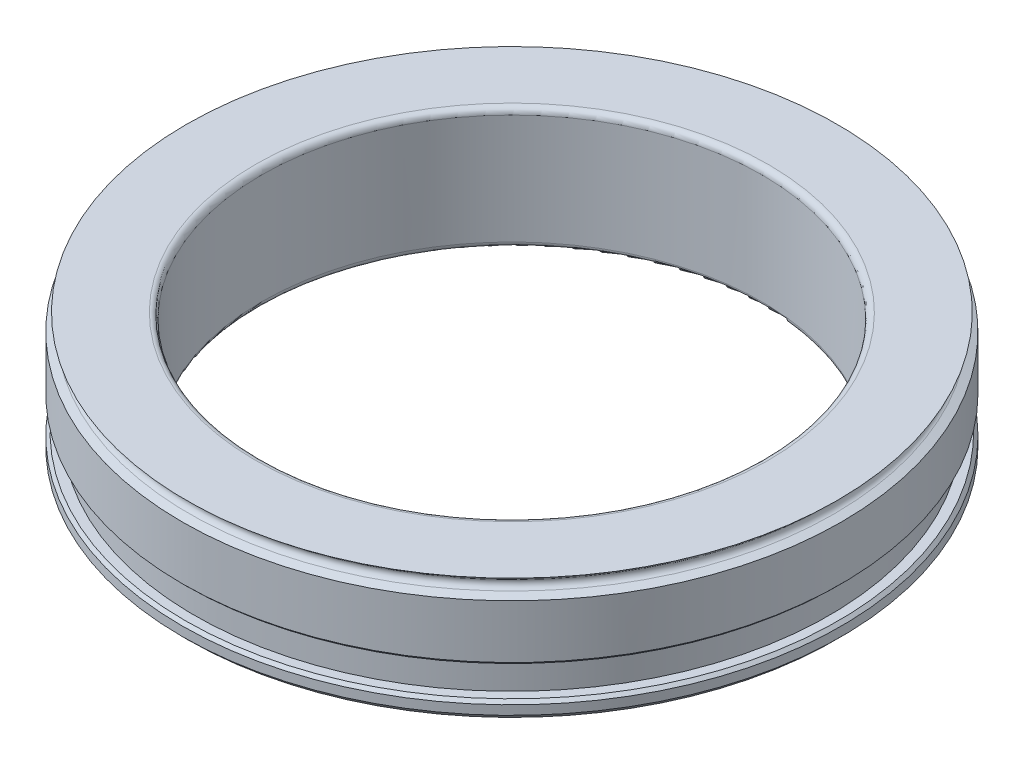
ISO-10303-21;
HEADER;
FILE_DESCRIPTION(('STEP AP214'),'2;1');
FILE_NAME('part.step','',(''),(''),'','','');
FILE_SCHEMA(('AUTOMOTIVE_DESIGN { 1 0 10303 214 1 1 1 1 }'));
ENDSEC;
DATA;
#1=APPLICATION_CONTEXT('core data for automotive mechanical design processes');
#2=APPLICATION_PROTOCOL_DEFINITION('international standard','automotive_design',2000,#1);
#3=PRODUCT_CONTEXT('',#1,'mechanical');
#4=PRODUCT('Part','Part','',(#3));
#5=PRODUCT_RELATED_PRODUCT_CATEGORY('part','',(#4));
#6=PRODUCT_DEFINITION_FORMATION('','',#4);
#7=PRODUCT_DEFINITION_CONTEXT('part definition',#1,'design');
#8=PRODUCT_DEFINITION('design','',#6,#7);
#9=PRODUCT_DEFINITION_SHAPE('','',#8);
#10=(LENGTH_UNIT() NAMED_UNIT(*) SI_UNIT(.MILLI.,.METRE.));
#11=(NAMED_UNIT(*) PLANE_ANGLE_UNIT() SI_UNIT($,.RADIAN.));
#12=(NAMED_UNIT(*) SI_UNIT($,.STERADIAN.) SOLID_ANGLE_UNIT());
#13=UNCERTAINTY_MEASURE_WITH_UNIT(LENGTH_MEASURE(1.E-05),#10,'distance_accuracy_value','');
#14=(GEOMETRIC_REPRESENTATION_CONTEXT(3) GLOBAL_UNCERTAINTY_ASSIGNED_CONTEXT((#13)) GLOBAL_UNIT_ASSIGNED_CONTEXT((#10,
#11,#12)) REPRESENTATION_CONTEXT('',''));
#15=CARTESIAN_POINT('',(0.,0.,0.));
#16=DIRECTION('',(0.,0.,1.));
#17=DIRECTION('',(1.,0.,0.));
#18=AXIS2_PLACEMENT_3D('',#15,#16,#17);
#19=CARTESIAN_POINT('',(0.,0.,0.));
#20=DIRECTION('',(0.,-1.,0.));
#21=DIRECTION('',(-1.,0.,0.));
#22=AXIS2_PLACEMENT_3D('',#19,#20,#21);
#23=CYLINDRICAL_SURFACE('',#22,42.5);
#24=CARTESIAN_POINT('',(0.,0.,0.));
#25=DIRECTION('',(0.,-1.,0.));
#26=DIRECTION('',(1.,0.,0.));
#27=AXIS2_PLACEMENT_3D('',#24,#25,#26);
#28=CIRCLE('',#27,42.5);
#29=CARTESIAN_POINT('',(42.5,0.,0.));
#30=VERTEX_POINT('',#29);
#31=EDGE_CURVE('E292',#30,#30,#28,.T.);
#32=ORIENTED_EDGE('',*,*,#31,.F.);
#33=DIRECTION('',(0.,1.,0.));
#34=VECTOR('',#33,1.);
#35=CARTESIAN_POINT('',(42.5,0.,0.));
#36=LINE('',#35,#34);
#37=CARTESIAN_POINT('',(42.5,2.2,0.));
#38=VERTEX_POINT('',#37);
#39=EDGE_CURVE('E11',#30,#38,#36,.T.);
#40=ORIENTED_EDGE('',*,*,#39,.T.);
#41=CARTESIAN_POINT('',(0.,2.2,0.));
#42=DIRECTION('',(0.,1.,0.));
#43=DIRECTION('',(-1.,0.,0.));
#44=AXIS2_PLACEMENT_3D('',#41,#42,#43);
#45=CIRCLE('',#44,42.5);
#46=EDGE_CURVE('E28',#38,#38,#45,.T.);
#47=ORIENTED_EDGE('',*,*,#46,.F.);
#48=ORIENTED_EDGE('',*,*,#39,.F.);
#49=EDGE_LOOP('',(#32,#40,#47,#48));
#50=FACE_BOUND('',#49,.T.);
#51=ADVANCED_FACE('F17',(#50),#23,.T.);
#52=CARTESIAN_POINT('',(0.,2.2,0.));
#53=DIRECTION('',(0.,-1.,0.));
#54=DIRECTION('',(0.,0.,-1.));
#55=AXIS2_PLACEMENT_3D('',#52,#53,#54);
#56=PLANE('',#55);
#57=ORIENTED_EDGE('',*,*,#46,.T.);
#58=EDGE_LOOP('',(#57));
#59=FACE_BOUND('',#58,.T.);
#60=CARTESIAN_POINT('',(0.,2.2,0.));
#61=DIRECTION('',(0.,-1.,0.));
#62=DIRECTION('',(-1.,0.,0.));
#63=AXIS2_PLACEMENT_3D('',#60,#61,#62);
#64=CIRCLE('',#63,45.5);
#65=CARTESIAN_POINT('',(45.5,2.2,0.));
#66=VERTEX_POINT('',#65);
#67=EDGE_CURVE('E358',#66,#66,#64,.T.);
#68=ORIENTED_EDGE('',*,*,#67,.T.);
#69=EDGE_LOOP('',(#68));
#70=FACE_BOUND('',#69,.T.);
#71=ADVANCED_FACE('F528',(#59,#70),#56,.T.);
#72=CARTESIAN_POINT('',(0.,0.,0.));
#73=DIRECTION('',(0.,-1.,0.));
#74=DIRECTION('',(-1.,0.,0.));
#75=AXIS2_PLACEMENT_3D('',#72,#73,#74);
#76=CYLINDRICAL_SURFACE('',#75,45.5);
#77=ORIENTED_EDGE('',*,*,#67,.F.);
#78=DIRECTION('',(0.,-1.,0.));
#79=VECTOR('',#78,1.);
#80=CARTESIAN_POINT('',(45.5,0.,0.));
#81=LINE('',#80,#79);
#82=CARTESIAN_POINT('',(45.5,0.,0.));
#83=VERTEX_POINT('',#82);
#84=EDGE_CURVE('E276',#66,#83,#81,.T.);
#85=ORIENTED_EDGE('',*,*,#84,.T.);
#86=CARTESIAN_POINT('',(0.,0.,0.));
#87=DIRECTION('',(0.,-1.,0.));
#88=DIRECTION('',(-1.,0.,0.));
#89=AXIS2_PLACEMENT_3D('',#86,#87,#88);
#90=CIRCLE('',#89,45.5);
#91=EDGE_CURVE('E426',#83,#83,#90,.T.);
#92=ORIENTED_EDGE('',*,*,#91,.T.);
#93=ORIENTED_EDGE('',*,*,#84,.F.);
#94=EDGE_LOOP('',(#77,#85,#92,#93));
#95=FACE_BOUND('',#94,.T.);
#96=ADVANCED_FACE('F533',(#95),#76,.F.);
#97=CARTESIAN_POINT('',(0.,8.,0.));
#98=DIRECTION('',(0.,1.,0.));
#99=DIRECTION('',(1.,0.,0.));
#100=AXIS2_PLACEMENT_3D('',#97,#98,#99);
#101=PLANE('',#100);
#102=CARTESIAN_POINT('',(0.,8.,0.));
#103=DIRECTION('',(0.,-1.,0.));
#104=DIRECTION('',(1.,0.,0.));
#105=AXIS2_PLACEMENT_3D('',#102,#103,#104);
#106=CIRCLE('',#105,52.);
#107=CARTESIAN_POINT('',(-52.,8.,0.));
#108=VERTEX_POINT('',#107);
#109=EDGE_CURVE('E291',#108,#108,#106,.T.);
#110=ORIENTED_EDGE('',*,*,#109,.F.);
#111=EDGE_LOOP('',(#110));
#112=FACE_BOUND('',#111,.T.);
#113=CARTESIAN_POINT('',(0.,8.,-5.753728067095E-13));
#114=DIRECTION('',(0.,1.,0.));
#115=DIRECTION('',(1.,0.,0.));
#116=AXIS2_PLACEMENT_3D('',#113,#114,#115);
#117=CIRCLE('',#116,53.5);
#118=CARTESIAN_POINT('',(0.,8.000000000001,53.4999999999984));
#119=VERTEX_POINT('',#118);
#120=EDGE_CURVE('E269',#119,#119,#117,.T.);
#121=ORIENTED_EDGE('',*,*,#120,.F.);
#122=EDGE_LOOP('',(#121));
#123=FACE_BOUND('',#122,.T.);
#124=ADVANCED_FACE('F562',(#112,#123),#101,.F.);
#125=CARTESIAN_POINT('',(0.,2.75,0.));
#126=DIRECTION('',(0.,1.,0.));
#127=DIRECTION('',(1.,0.,0.));
#128=AXIS2_PLACEMENT_3D('',#125,#126,#127);
#129=CYLINDRICAL_SURFACE('',#128,52.);
#130=ORIENTED_EDGE('',*,*,#109,.T.);
#131=DIRECTION('',(0.,-1.,0.));
#132=VECTOR('',#131,1.);
#133=CARTESIAN_POINT('',(-52.,2.75,0.));
#134=LINE('',#133,#132);
#135=CARTESIAN_POINT('',(-52.,3.,0.));
#136=VERTEX_POINT('',#135);
#137=EDGE_CURVE('E79',#108,#136,#134,.T.);
#138=ORIENTED_EDGE('',*,*,#137,.T.);
#139=CARTESIAN_POINT('',(0.,3.,0.));
#140=DIRECTION('',(0.,1.,0.));
#141=DIRECTION('',(1.,0.,0.));
#142=AXIS2_PLACEMENT_3D('',#139,#140,#141);
#143=CIRCLE('',#142,52.);
#144=EDGE_CURVE('E288',#136,#136,#143,.T.);
#145=ORIENTED_EDGE('',*,*,#144,.T.);
#146=ORIENTED_EDGE('',*,*,#137,.F.);
#147=EDGE_LOOP('',(#130,#138,#145,#146));
#148=FACE_BOUND('',#147,.T.);
#149=ADVANCED_FACE('F522',(#148),#129,.T.);
#150=CARTESIAN_POINT('',(0.,3.,0.));
#151=DIRECTION('',(0.,1.,0.));
#152=DIRECTION('',(1.,0.,0.));
#153=AXIS2_PLACEMENT_3D('',#150,#151,#152);
#154=PLANE('',#153);
#155=ORIENTED_EDGE('',*,*,#144,.F.);
#156=EDGE_LOOP('',(#155));
#157=FACE_BOUND('',#156,.T.);
#158=CARTESIAN_POINT('',(0.,3.,0.));
#159=DIRECTION('',(0.,-1.,0.));
#160=DIRECTION('',(1.,0.,0.));
#161=AXIS2_PLACEMENT_3D('',#158,#159,#160);
#162=CIRCLE('',#161,53.5);
#163=CARTESIAN_POINT('',(0.,2.999999999999,53.499999999999));
#164=VERTEX_POINT('',#163);
#165=EDGE_CURVE('E91',#164,#164,#162,.T.);
#166=ORIENTED_EDGE('',*,*,#165,.F.);
#167=EDGE_LOOP('',(#166));
#168=FACE_BOUND('',#167,.T.);
#169=ADVANCED_FACE('F514',(#157,#168),#154,.T.);
#170=CARTESIAN_POINT('',(0.,2.750000000108,0.));
#171=DIRECTION('',(0.,-1.,0.));
#172=DIRECTION('',(0.,0.,-1.));
#173=AXIS2_PLACEMENT_3D('',#170,#171,#172);
#174=CONICAL_SURFACE('',#173,53.74999999989,0.785398163397448);
#175=CARTESIAN_POINT('',(0.,2.5,0.));
#176=DIRECTION('',(0.,-1.,0.));
#177=DIRECTION('',(-1.,0.,0.));
#178=AXIS2_PLACEMENT_3D('',#175,#176,#177);
#179=CIRCLE('',#178,54.);
#180=CARTESIAN_POINT('',(-54.,2.5,0.));
#181=VERTEX_POINT('',#180);
#182=CARTESIAN_POINT('',(0.,2.499999999999,53.999999999999));
#183=VERTEX_POINT('',#182);
#184=EDGE_CURVE('E364',#181,#183,#179,.T.);
#185=ORIENTED_EDGE('',*,*,#184,.F.);
#186=CARTESIAN_POINT('',(0.,2.5,0.));
#187=DIRECTION('',(0.,-1.,0.));
#188=DIRECTION('',(-1.,0.,0.));
#189=AXIS2_PLACEMENT_3D('',#186,#187,#188);
#190=CIRCLE('',#189,54.);
#191=EDGE_CURVE('E304',#183,#181,#190,.T.);
#192=ORIENTED_EDGE('',*,*,#191,.F.);
#193=DIRECTION('',(0.,0.707106781186548,-0.707106781186548));
#194=VECTOR('',#193,1.);
#195=CARTESIAN_POINT('',(0.,2.750000000108,53.74999999989));
#196=LINE('',#195,#194);
#197=EDGE_CURVE('E415',#183,#164,#196,.T.);
#198=ORIENTED_EDGE('',*,*,#197,.T.);
#199=ORIENTED_EDGE('',*,*,#165,.T.);
#200=ORIENTED_EDGE('',*,*,#197,.F.);
#201=EDGE_LOOP('',(#185,#192,#198,#199,#200));
#202=FACE_BOUND('',#201,.T.);
#203=ADVANCED_FACE('F512',(#202),#174,.T.);
#204=CARTESIAN_POINT('',(0.,0.4999999999025,0.));
#205=DIRECTION('',(0.,1.,0.));
#206=DIRECTION('',(0.,0.,-1.));
#207=AXIS2_PLACEMENT_3D('',#204,#205,#206);
#208=CONICAL_SURFACE('',#207,53.4999999999,0.785398163397448);
#209=CARTESIAN_POINT('',(0.,0.9999999999998,0.));
#210=DIRECTION('',(0.,1.,0.));
#211=DIRECTION('',(1.,0.,0.));
#212=AXIS2_PLACEMENT_3D('',#209,#210,#211);
#213=CIRCLE('',#212,54.);
#214=CARTESIAN_POINT('',(0.,1.00000000000115,53.9999999999987));
#215=VERTEX_POINT('',#214);
#216=CARTESIAN_POINT('',(-54.,0.9999999999998,0.));
#217=VERTEX_POINT('',#216);
#218=EDGE_CURVE('E281',#215,#217,#213,.T.);
#219=ORIENTED_EDGE('',*,*,#218,.F.);
#220=DIRECTION('',(0.,-0.707106781186548,-0.707106781186548));
#221=VECTOR('',#220,1.);
#222=CARTESIAN_POINT('',(0.,0.4999999999025,53.4999999999));
#223=LINE('',#222,#221);
#224=CARTESIAN_POINT('',(0.,1.11868847518792E-12,52.9999999999986));
#225=VERTEX_POINT('',#224);
#226=EDGE_CURVE('E272',#215,#225,#223,.T.);
#227=ORIENTED_EDGE('',*,*,#226,.T.);
#228=CARTESIAN_POINT('',(0.,0.,-2.849977453795E-13));
#229=DIRECTION('',(0.,1.,0.));
#230=DIRECTION('',(1.,0.,0.));
#231=AXIS2_PLACEMENT_3D('',#228,#229,#230);
#232=CIRCLE('',#231,53.);
#233=EDGE_CURVE('E316',#225,#225,#232,.T.);
#234=ORIENTED_EDGE('',*,*,#233,.T.);
#235=ORIENTED_EDGE('',*,*,#226,.F.);
#236=CARTESIAN_POINT('',(0.,0.9999999999998,0.));
#237=DIRECTION('',(0.,1.,0.));
#238=DIRECTION('',(1.,0.,0.));
#239=AXIS2_PLACEMENT_3D('',#236,#237,#238);
#240=CIRCLE('',#239,54.);
#241=EDGE_CURVE('E277',#217,#215,#240,.T.);
#242=ORIENTED_EDGE('',*,*,#241,.F.);
#243=EDGE_LOOP('',(#219,#227,#234,#235,#242));
#244=FACE_BOUND('',#243,.T.);
#245=ADVANCED_FACE('F506',(#244),#208,.T.);
#246=CARTESIAN_POINT('',(0.,8.249999999892,-5.753728067095E-13));
#247=DIRECTION('',(0.,1.,0.));
#248=DIRECTION('',(0.,0.,-1.));
#249=AXIS2_PLACEMENT_3D('',#246,#247,#248);
#250=CONICAL_SURFACE('',#249,53.74999999989,0.785398163397448);
#251=CARTESIAN_POINT('',(0.,8.5,0.));
#252=DIRECTION('',(0.,1.,0.));
#253=DIRECTION('',(1.,0.,0.));
#254=AXIS2_PLACEMENT_3D('',#251,#252,#253);
#255=CIRCLE('',#254,54.);
#256=CARTESIAN_POINT('',(0.,8.50000000000129,53.9999999999987));
#257=VERTEX_POINT('',#256);
#258=CARTESIAN_POINT('',(-54.,8.5,0.));
#259=VERTEX_POINT('',#258);
#260=EDGE_CURVE('E353',#257,#259,#255,.T.);
#261=ORIENTED_EDGE('',*,*,#260,.F.);
#262=DIRECTION('',(0.,-0.707106781186548,-0.707106781186548));
#263=VECTOR('',#262,1.);
#264=CARTESIAN_POINT('',(0.,8.249999999892,53.7499999998894));
#265=LINE('',#264,#263);
#266=EDGE_CURVE('E273',#257,#119,#265,.T.);
#267=ORIENTED_EDGE('',*,*,#266,.T.);
#268=ORIENTED_EDGE('',*,*,#120,.T.);
#269=ORIENTED_EDGE('',*,*,#266,.F.);
#270=CARTESIAN_POINT('',(0.,8.5,0.));
#271=DIRECTION('',(0.,1.,0.));
#272=DIRECTION('',(1.,0.,0.));
#273=AXIS2_PLACEMENT_3D('',#270,#271,#272);
#274=CIRCLE('',#273,54.);
#275=EDGE_CURVE('E349',#259,#257,#274,.T.);
#276=ORIENTED_EDGE('',*,*,#275,.F.);
#277=EDGE_LOOP('',(#261,#267,#268,#269,#276));
#278=FACE_BOUND('',#277,.T.);
#279=ADVANCED_FACE('F19',(#278),#250,.T.);
#280=CARTESIAN_POINT('',(0.,-1.,0.));
#281=DIRECTION('',(0.,1.,0.));
#282=DIRECTION('',(1.,0.,0.));
#283=AXIS2_PLACEMENT_3D('',#280,#281,#282);
#284=CYLINDRICAL_SURFACE('',#283,54.);
#285=ORIENTED_EDGE('',*,*,#184,.T.);
#286=ORIENTED_EDGE('',*,*,#191,.T.);
#287=DIRECTION('',(0.,-1.,0.));
#288=VECTOR('',#287,1.);
#289=CARTESIAN_POINT('',(-54.,-1.,0.));
#290=LINE('',#289,#288);
#291=EDGE_CURVE('E282',#181,#217,#290,.T.);
#292=ORIENTED_EDGE('',*,*,#291,.T.);
#293=ORIENTED_EDGE('',*,*,#241,.T.);
#294=ORIENTED_EDGE('',*,*,#218,.T.);
#295=ORIENTED_EDGE('',*,*,#291,.F.);
#296=EDGE_LOOP('',(#285,#286,#292,#293,#294,#295));
#297=FACE_BOUND('',#296,.T.);
#298=ADVANCED_FACE('F509',(#297),#284,.T.);
#299=CARTESIAN_POINT('',(0.,-1.,0.));
#300=DIRECTION('',(0.,1.,0.));
#301=DIRECTION('',(1.,0.,0.));
#302=AXIS2_PLACEMENT_3D('',#299,#300,#301);
#303=CYLINDRICAL_SURFACE('',#302,54.);
#304=CARTESIAN_POINT('',(0.,17.25938016844,0.));
#305=DIRECTION('',(0.,-1.,0.));
#306=DIRECTION('',(1.,0.,0.));
#307=AXIS2_PLACEMENT_3D('',#304,#305,#306);
#308=CIRCLE('',#307,54.);
#309=CARTESIAN_POINT('',(54.,17.25938016844,0.));
#310=VERTEX_POINT('',#309);
#311=CARTESIAN_POINT('',(-54.,17.25938016844,0.));
#312=VERTEX_POINT('',#311);
#313=EDGE_CURVE('E341',#310,#312,#308,.T.);
#314=ORIENTED_EDGE('',*,*,#313,.T.);
#315=DIRECTION('',(0.,-1.,0.));
#316=VECTOR('',#315,1.);
#317=CARTESIAN_POINT('',(-54.,-1.,0.));
#318=LINE('',#317,#316);
#319=EDGE_CURVE('E354',#312,#259,#318,.T.);
#320=ORIENTED_EDGE('',*,*,#319,.T.);
#321=ORIENTED_EDGE('',*,*,#275,.T.);
#322=ORIENTED_EDGE('',*,*,#260,.T.);
#323=ORIENTED_EDGE('',*,*,#319,.F.);
#324=CARTESIAN_POINT('',(0.,17.25938016844,0.));
#325=DIRECTION('',(0.,-1.,0.));
#326=DIRECTION('',(1.,0.,0.));
#327=AXIS2_PLACEMENT_3D('',#324,#325,#326);
#328=CIRCLE('',#327,54.);
#329=EDGE_CURVE('E370',#312,#310,#328,.T.);
#330=ORIENTED_EDGE('',*,*,#329,.T.);
#331=EDGE_LOOP('',(#314,#320,#321,#322,#323,#330));
#332=FACE_BOUND('',#331,.T.);
#333=ADVANCED_FACE('F544',(#332),#303,.T.);
#334=CARTESIAN_POINT('',(0.,17.51588508953,0.));
#335=DIRECTION('',(0.,-1.,0.));
#336=DIRECTION('',(-1.,0.,0.));
#337=AXIS2_PLACEMENT_3D('',#334,#335,#336);
#338=CONICAL_SURFACE('',#337,53.38438818938,1.17600520709514);
#339=ORIENTED_EDGE('',*,*,#313,.F.);
#340=DIRECTION('',(-0.923076923076926,0.384615384615378,0.));
#341=VECTOR('',#340,1.);
#342=CARTESIAN_POINT('',(53.38438818938,17.51588508953,0.));
#343=LINE('',#342,#341);
#344=CARTESIAN_POINT('',(52.7687763787521,17.772390010625,0.));
#345=VERTEX_POINT('',#344);
#346=EDGE_CURVE('E347',#310,#345,#343,.T.);
#347=ORIENTED_EDGE('',*,*,#346,.T.);
#348=CARTESIAN_POINT('',(0.,17.77239001062,0.));
#349=DIRECTION('',(0.,-1.,0.));
#350=DIRECTION('',(-1.,0.,0.));
#351=AXIS2_PLACEMENT_3D('',#348,#349,#350);
#352=CIRCLE('',#351,52.76877637875);
#353=CARTESIAN_POINT('',(52.7682735901043,17.77239001062,-0.230353707210886));
#354=VERTEX_POINT('',#353);
#355=EDGE_CURVE('E300',#345,#354,#352,.T.);
#356=ORIENTED_EDGE('',*,*,#355,.T.);
#357=CARTESIAN_POINT('',(0.,17.77239001062,0.));
#358=DIRECTION('',(0.,-1.,0.));
#359=DIRECTION('',(-1.,0.,0.));
#360=AXIS2_PLACEMENT_3D('',#357,#358,#359);
#361=CIRCLE('',#360,52.76877637875);
#362=EDGE_CURVE('E337',#354,#345,#361,.T.);
#363=ORIENTED_EDGE('',*,*,#362,.T.);
#364=ORIENTED_EDGE('',*,*,#346,.F.);
#365=ORIENTED_EDGE('',*,*,#329,.F.);
#366=EDGE_LOOP('',(#339,#347,#356,#363,#364,#365));
#367=FACE_BOUND('',#366,.T.);
#368=ADVANCED_FACE('F540',(#367),#338,.T.);
#369=CARTESIAN_POINT('',(0.,18.6954669337,0.));
#370=DIRECTION('',(0.,1.,0.));
#371=DIRECTION('',(-0.99999047185324,0.,0.00436534107892717));
#372=AXIS2_PLACEMENT_3D('',#369,#370,#371);
#373=TOROIDAL_SURFACE('',#372,53.15339176337,1.);
#374=CARTESIAN_POINT('',(0.,19.53887872652,0.));
#375=DIRECTION('',(0.,-1.,0.));
#376=DIRECTION('',(-1.,0.,0.));
#377=AXIS2_PLACEMENT_3D('',#374,#375,#376);
#378=CIRCLE('',#377,52.61612409476);
#379=CARTESIAN_POINT('',(52.6156227606077,19.53887872652,-0.229687327924792));
#380=VERTEX_POINT('',#379);
#381=CARTESIAN_POINT('',(-52.6161240947599,19.5388787265202,0.));
#382=VERTEX_POINT('',#381);
#383=EDGE_CURVE('E404',#380,#382,#378,.T.);
#384=ORIENTED_EDGE('',*,*,#383,.T.);
#385=CARTESIAN_POINT('',(0.,19.53887872652,0.));
#386=DIRECTION('',(0.,-1.,0.));
#387=DIRECTION('',(-1.,0.,0.));
#388=AXIS2_PLACEMENT_3D('',#385,#386,#387);
#389=CIRCLE('',#388,52.61612409476);
#390=EDGE_CURVE('E301',#382,#380,#389,.T.);
#391=ORIENTED_EDGE('',*,*,#390,.T.);
#392=CARTESIAN_POINT('',(53.1528853100525,18.6954669337,-0.232032684548955));
#393=DIRECTION('',(0.0043653410789273,0.,0.99999047185324));
#394=DIRECTION('',(0.99999047185324,0.,-0.0043653410789273));
#395=AXIS2_PLACEMENT_3D('',#392,#393,#394);
#396=CIRCLE('',#395,1.);
#397=EDGE_CURVE('E296',#380,#354,#396,.T.);
#398=ORIENTED_EDGE('',*,*,#397,.T.);
#399=ORIENTED_EDGE('',*,*,#355,.F.);
#400=ORIENTED_EDGE('',*,*,#362,.F.);
#401=ORIENTED_EDGE('',*,*,#397,.F.);
#402=EDGE_LOOP('',(#384,#391,#398,#399,#400,#401));
#403=FACE_BOUND('',#402,.T.);
#404=ADVANCED_FACE('F543',(#403),#373,.F.);
#405=CARTESIAN_POINT('',(0.,19.76943936326,0.));
#406=DIRECTION('',(0.,1.,0.));
#407=DIRECTION('',(1.,0.,0.));
#408=AXIS2_PLACEMENT_3D('',#405,#406,#407);
#409=CONICAL_SURFACE('',#408,52.97806204738,1.00360219003479);
#410=CARTESIAN_POINT('',(0.,20.,0.));
#411=DIRECTION('',(0.,1.,0.));
#412=DIRECTION('',(1.,0.,0.));
#413=AXIS2_PLACEMENT_3D('',#410,#411,#412);
#414=CIRCLE('',#413,53.34);
#415=CARTESIAN_POINT('',(-53.34,20.,0.));
#416=VERTEX_POINT('',#415);
#417=EDGE_CURVE('E21',#416,#416,#414,.T.);
#418=ORIENTED_EDGE('',*,*,#417,.F.);
#419=DIRECTION('',(0.843411792818451,-0.537267668611063,0.));
#420=VECTOR('',#419,1.);
#421=CARTESIAN_POINT('',(-52.97806204738,19.76943936326,0.));
#422=LINE('',#421,#420);
#423=EDGE_CURVE('E400',#416,#382,#422,.T.);
#424=ORIENTED_EDGE('',*,*,#423,.T.);
#425=ORIENTED_EDGE('',*,*,#383,.F.);
#426=ORIENTED_EDGE('',*,*,#390,.F.);
#427=ORIENTED_EDGE('',*,*,#423,.F.);
#428=EDGE_LOOP('',(#418,#424,#425,#426,#427));
#429=FACE_BOUND('',#428,.T.);
#430=ADVANCED_FACE('F393',(#429),#409,.T.);
#431=CARTESIAN_POINT('',(0.,20.,0.));
#432=DIRECTION('',(0.,1.,0.));
#433=DIRECTION('',(1.,0.,0.));
#434=AXIS2_PLACEMENT_3D('',#431,#432,#433);
#435=PLANE('',#434);
#436=CARTESIAN_POINT('',(0.,20.,0.));
#437=DIRECTION('',(0.,1.,0.));
#438=DIRECTION('',(-1.,0.,0.));
#439=AXIS2_PLACEMENT_3D('',#436,#437,#438);
#440=CIRCLE('',#439,42.);
#441=CARTESIAN_POINT('',(41.9992294255706,20.,0.254416309001935));
#442=VERTEX_POINT('',#441);
#443=EDGE_CURVE('E262',#442,#442,#440,.T.);
#444=ORIENTED_EDGE('',*,*,#443,.F.);
#445=EDGE_LOOP('',(#444));
#446=FACE_BOUND('',#445,.T.);
#447=ORIENTED_EDGE('',*,*,#417,.T.);
#448=EDGE_LOOP('',(#447));
#449=FACE_BOUND('',#448,.T.);
#450=ADVANCED_FACE('F390',(#446,#449),#435,.T.);
#451=CARTESIAN_POINT('',(0.,19.,0.));
#452=DIRECTION('',(0.,1.,0.));
#453=DIRECTION('',(-0.999981652989776,0.,-0.00605753116671286));
#454=AXIS2_PLACEMENT_3D('',#451,#452,#453);
#455=TOROIDAL_SURFACE('',#454,42.,1.);
#456=CARTESIAN_POINT('',(0.,19.,0.));
#457=DIRECTION('',(0.,1.,0.));
#458=DIRECTION('',(-1.,0.,0.));
#459=AXIS2_PLACEMENT_3D('',#456,#457,#458);
#460=CIRCLE('',#459,41.);
#461=CARTESIAN_POINT('',(-41.,19.,0.));
#462=VERTEX_POINT('',#461);
#463=CARTESIAN_POINT('',(40.9992477725808,19.,0.248358777835222));
#464=VERTEX_POINT('',#463);
#465=EDGE_CURVE('E336',#462,#464,#460,.T.);
#466=ORIENTED_EDGE('',*,*,#465,.F.);
#467=CARTESIAN_POINT('',(0.,19.,0.));
#468=DIRECTION('',(0.,1.,0.));
#469=DIRECTION('',(-1.,0.,0.));
#470=AXIS2_PLACEMENT_3D('',#467,#468,#469);
#471=CIRCLE('',#470,41.);
#472=EDGE_CURVE('E263',#464,#462,#471,.T.);
#473=ORIENTED_EDGE('',*,*,#472,.F.);
#474=CARTESIAN_POINT('',(41.9992294255706,19.,0.254416309001935));
#475=DIRECTION('',(0.00605753116671273,0.,-0.999981652989776));
#476=DIRECTION('',(0.999981652989776,0.,0.00605753116671273));
#477=AXIS2_PLACEMENT_3D('',#474,#475,#476);
#478=CIRCLE('',#477,1.);
#479=EDGE_CURVE('E258',#464,#442,#478,.T.);
#480=ORIENTED_EDGE('',*,*,#479,.T.);
#481=ORIENTED_EDGE('',*,*,#443,.T.);
#482=ORIENTED_EDGE('',*,*,#479,.F.);
#483=EDGE_LOOP('',(#466,#473,#480,#481,#482));
#484=FACE_BOUND('',#483,.T.);
#485=ADVANCED_FACE('F387',(#484),#455,.T.);
#486=CARTESIAN_POINT('',(0.,-1.,0.));
#487=DIRECTION('',(0.,1.,0.));
#488=DIRECTION('',(1.,0.,0.));
#489=AXIS2_PLACEMENT_3D('',#486,#487,#488);
#490=CYLINDRICAL_SURFACE('',#489,41.);
#491=CARTESIAN_POINT('',(0.,1.,0.));
#492=DIRECTION('',(0.,1.,0.));
#493=DIRECTION('',(1.,0.,0.));
#494=AXIS2_PLACEMENT_3D('',#491,#492,#493);
#495=CIRCLE('',#494,41.);
#496=CARTESIAN_POINT('',(-41.,1.,0.));
#497=VERTEX_POINT('',#496);
#498=CARTESIAN_POINT('',(-40.9993153992791,1.,-0.236932037593123));
#499=VERTEX_POINT('',#498);
#500=EDGE_CURVE('E321',#497,#499,#495,.T.);
#501=ORIENTED_EDGE('',*,*,#500,.F.);
#502=DIRECTION('',(0.,1.,0.));
#503=VECTOR('',#502,1.);
#504=CARTESIAN_POINT('',(-41.,-1.,0.));
#505=LINE('',#504,#503);
#506=EDGE_CURVE('E324',#497,#462,#505,.T.);
#507=ORIENTED_EDGE('',*,*,#506,.T.);
#508=ORIENTED_EDGE('',*,*,#465,.T.);
#509=ORIENTED_EDGE('',*,*,#472,.T.);
#510=ORIENTED_EDGE('',*,*,#506,.F.);
#511=CARTESIAN_POINT('',(0.,1.,0.));
#512=DIRECTION('',(0.,1.,0.));
#513=DIRECTION('',(1.,0.,0.));
#514=AXIS2_PLACEMENT_3D('',#511,#512,#513);
#515=CIRCLE('',#514,41.);
#516=EDGE_CURVE('E325',#499,#497,#515,.T.);
#517=ORIENTED_EDGE('',*,*,#516,.F.);
#518=EDGE_LOOP('',(#501,#507,#508,#509,#510,#517));
#519=FACE_BOUND('',#518,.T.);
#520=ADVANCED_FACE('F381',(#519),#490,.F.);
#521=CARTESIAN_POINT('',(0.,1.,0.));
#522=DIRECTION('',(0.,1.,0.));
#523=DIRECTION('',(0.999983302421441,0.,0.00577883018519824));
#524=AXIS2_PLACEMENT_3D('',#521,#522,#523);
#525=TOROIDAL_SURFACE('',#524,42.,1.);
#526=CARTESIAN_POINT('',(0.,0.,0.));
#527=DIRECTION('',(0.,1.,0.));
#528=DIRECTION('',(1.,0.,0.));
#529=AXIS2_PLACEMENT_3D('',#526,#527,#528);
#530=CIRCLE('',#529,42.);
#531=CARTESIAN_POINT('',(-41.9992987017005,0.,-0.242710867778321));
#532=VERTEX_POINT('',#531);
#533=EDGE_CURVE('E295',#532,#532,#530,.T.);
#534=ORIENTED_EDGE('',*,*,#533,.F.);
#535=CARTESIAN_POINT('',(-41.9992987017005,1.,-0.242710867778321));
#536=DIRECTION('',(-0.00577883018519811,0.,0.999983302421441));
#537=DIRECTION('',(-0.999983302421441,0.,-0.00577883018519811));
#538=AXIS2_PLACEMENT_3D('',#535,#536,#537);
#539=CIRCLE('',#538,1.);
#540=EDGE_CURVE('E194',#532,#499,#539,.T.);
#541=ORIENTED_EDGE('',*,*,#540,.T.);
#542=ORIENTED_EDGE('',*,*,#516,.T.);
#543=ORIENTED_EDGE('',*,*,#500,.T.);
#544=ORIENTED_EDGE('',*,*,#540,.F.);
#545=EDGE_LOOP('',(#534,#541,#542,#543,#544));
#546=FACE_BOUND('',#545,.T.);
#547=ADVANCED_FACE('F575',(#546),#525,.T.);
#548=CARTESIAN_POINT('',(42.43524478544,10.44809233428,-24.5));
#549=DIRECTION('',(0.,-1.,0.));
#550=DIRECTION('',(-0.500000000000017,0.,-0.866025403784429));
#551=AXIS2_PLACEMENT_3D('',#548,#549,#550);
#552=CONICAL_SURFACE('',#551,0.904249121851,1.02974425867665);
#553=DIRECTION('',(0.42858365035107,-0.515038074910054,0.742328657701356));
#554=VECTOR('',#553,1.);
#555=CARTESIAN_POINT('',(42.8873693463655,10.44809233428,-23.7168972891273));
#556=LINE('',#555,#554);
#557=CARTESIAN_POINT('',(42.43524478544,10.9914200214,-24.5));
#558=VERTEX_POINT('',#557);
#559=CARTESIAN_POINT('',(43.26024478544,10.,-23.0710580837557));
#560=VERTEX_POINT('',#559);
#561=EDGE_CURVE('E234',#558,#560,#556,.T.);
#562=ORIENTED_EDGE('',*,*,#561,.T.);
#563=CARTESIAN_POINT('',(42.43524478544,10.,-24.5));
#564=DIRECTION('',(0.,-1.,0.));
#565=DIRECTION('',(-0.500000000000017,0.,-0.866025403784429));
#566=AXIS2_PLACEMENT_3D('',#563,#564,#565);
#567=CIRCLE('',#566,1.65);
#568=EDGE_CURVE('E238',#560,#560,#567,.T.);
#569=ORIENTED_EDGE('',*,*,#568,.T.);
#570=ORIENTED_EDGE('',*,*,#561,.F.);
#571=EDGE_LOOP('',(#562,#569,#570));
#572=FACE_BOUND('',#571,.T.);
#573=ADVANCED_FACE('F236',(#572),#552,.F.);
#574=CARTESIAN_POINT('',(42.43524478544,11.54099102247,-24.5));
#575=DIRECTION('',(0.,-1.,0.));
#576=DIRECTION('',(-0.500000000000017,0.,-0.866025403784429));
#577=AXIS2_PLACEMENT_3D('',#574,#575,#576);
#578=CYLINDRICAL_SURFACE('',#577,1.65);
#579=ORIENTED_EDGE('',*,*,#568,.F.);
#580=DIRECTION('',(0.,-1.,0.));
#581=VECTOR('',#580,1.);
#582=CARTESIAN_POINT('',(43.26024478544,11.54099102247,-23.0710580837557));
#583=LINE('',#582,#581);
#584=CARTESIAN_POINT('',(43.26024478544,0.,-23.0710580837557));
#585=VERTEX_POINT('',#584);
#586=EDGE_CURVE('E240',#560,#585,#583,.T.);
#587=ORIENTED_EDGE('',*,*,#586,.T.);
#588=CARTESIAN_POINT('',(42.43524478544,0.,-24.5));
#589=DIRECTION('',(0.,-1.,0.));
#590=DIRECTION('',(-0.500000000000017,0.,-0.866025403784429));
#591=AXIS2_PLACEMENT_3D('',#588,#589,#590);
#592=CIRCLE('',#591,1.65);
#593=EDGE_CURVE('E246',#585,#585,#592,.T.);
#594=ORIENTED_EDGE('',*,*,#593,.T.);
#595=ORIENTED_EDGE('',*,*,#586,.F.);
#596=EDGE_LOOP('',(#579,#587,#594,#595));
#597=FACE_BOUND('',#596,.T.);
#598=ADVANCED_FACE('F244',(#597),#578,.F.);
#599=CARTESIAN_POINT('',(42.43524478544,10.44809233428,24.5));
#600=DIRECTION('',(0.,-1.,0.));
#601=DIRECTION('',(0.500000000000017,0.,-0.866025403784429));
#602=AXIS2_PLACEMENT_3D('',#599,#600,#601);
#603=CONICAL_SURFACE('',#602,0.904249121851,1.02974425867665);
#604=DIRECTION('',(-0.428583650351071,-0.515038074910054,0.742328657701356));
#605=VECTOR('',#604,1.);
#606=CARTESIAN_POINT('',(41.9831202245145,10.44809233428,25.2831027108727));
#607=LINE('',#606,#605);
#608=CARTESIAN_POINT('',(42.43524478544,10.9914200214,24.5));
#609=VERTEX_POINT('',#608);
#610=CARTESIAN_POINT('',(41.61024478544,10.,25.9289419162443));
#611=VERTEX_POINT('',#610);
#612=EDGE_CURVE('E253',#609,#611,#607,.T.);
#613=ORIENTED_EDGE('',*,*,#612,.T.);
#614=CARTESIAN_POINT('',(42.43524478544,10.,24.5));
#615=DIRECTION('',(0.,-1.,0.));
#616=DIRECTION('',(0.500000000000017,0.,-0.866025403784429));
#617=AXIS2_PLACEMENT_3D('',#614,#615,#616);
#618=CIRCLE('',#617,1.65);
#619=EDGE_CURVE('E286',#611,#611,#618,.T.);
#620=ORIENTED_EDGE('',*,*,#619,.T.);
#621=ORIENTED_EDGE('',*,*,#612,.F.);
#622=EDGE_LOOP('',(#613,#620,#621));
#623=FACE_BOUND('',#622,.T.);
#624=ADVANCED_FACE('F580',(#623),#603,.F.);
#625=CARTESIAN_POINT('',(42.43524478544,11.54099102247,24.5));
#626=DIRECTION('',(0.,-1.,0.));
#627=DIRECTION('',(0.500000000000017,0.,-0.866025403784429));
#628=AXIS2_PLACEMENT_3D('',#625,#626,#627);
#629=CYLINDRICAL_SURFACE('',#628,1.65);
#630=ORIENTED_EDGE('',*,*,#619,.F.);
#631=DIRECTION('',(0.,-1.,0.));
#632=VECTOR('',#631,1.);
#633=CARTESIAN_POINT('',(41.61024478544,11.54099102247,25.9289419162443));
#634=LINE('',#633,#632);
#635=CARTESIAN_POINT('',(41.61024478544,0.,25.9289419162443));
#636=VERTEX_POINT('',#635);
#637=EDGE_CURVE('E355',#611,#636,#634,.T.);
#638=ORIENTED_EDGE('',*,*,#637,.T.);
#639=CARTESIAN_POINT('',(42.43524478544,0.,24.5));
#640=DIRECTION('',(0.,-1.,0.));
#641=DIRECTION('',(0.500000000000017,0.,-0.866025403784429));
#642=AXIS2_PLACEMENT_3D('',#639,#640,#641);
#643=CIRCLE('',#642,1.65);
#644=EDGE_CURVE('E264',#636,#636,#643,.T.);
#645=ORIENTED_EDGE('',*,*,#644,.T.);
#646=ORIENTED_EDGE('',*,*,#637,.F.);
#647=EDGE_LOOP('',(#630,#638,#645,#646));
#648=FACE_BOUND('',#647,.T.);
#649=ADVANCED_FACE('F555',(#648),#629,.F.);
#650=CARTESIAN_POINT('',(0.,10.44809233428,49.));
#651=DIRECTION('',(0.,-1.,0.));
#652=DIRECTION('',(1.,0.,0.));
#653=AXIS2_PLACEMENT_3D('',#650,#651,#652);
#654=CONICAL_SURFACE('',#653,0.904249121851,1.02974425867665);
#655=DIRECTION('',(-0.857167300702112,-0.515038074910054,0.));
#656=VECTOR('',#655,1.);
#657=CARTESIAN_POINT('',(-0.904249121851,10.44809233428,49.));
#658=LINE('',#657,#656);
#659=CARTESIAN_POINT('',(0.,10.9914200214,49.));
#660=VERTEX_POINT('',#659);
#661=CARTESIAN_POINT('',(-1.65,10.,49.));
#662=VERTEX_POINT('',#661);
#663=EDGE_CURVE('E283',#660,#662,#658,.T.);
#664=ORIENTED_EDGE('',*,*,#663,.T.);
#665=CARTESIAN_POINT('',(0.,10.,49.));
#666=DIRECTION('',(0.,-1.,0.));
#667=DIRECTION('',(1.,0.,0.));
#668=AXIS2_PLACEMENT_3D('',#665,#666,#667);
#669=CIRCLE('',#668,1.65);
#670=EDGE_CURVE('E309',#662,#662,#669,.T.);
#671=ORIENTED_EDGE('',*,*,#670,.T.);
#672=ORIENTED_EDGE('',*,*,#663,.F.);
#673=EDGE_LOOP('',(#664,#671,#672));
#674=FACE_BOUND('',#673,.T.);
#675=ADVANCED_FACE('F550',(#674),#654,.F.);
#676=CARTESIAN_POINT('',(0.,11.54099102247,49.));
#677=DIRECTION('',(0.,-1.,0.));
#678=DIRECTION('',(1.,0.,0.));
#679=AXIS2_PLACEMENT_3D('',#676,#677,#678);
#680=CYLINDRICAL_SURFACE('',#679,1.65);
#681=ORIENTED_EDGE('',*,*,#670,.F.);
#682=DIRECTION('',(0.,-1.,0.));
#683=VECTOR('',#682,1.);
#684=CARTESIAN_POINT('',(-1.65,11.54099102247,49.));
#685=LINE('',#684,#683);
#686=CARTESIAN_POINT('',(-1.65,0.,49.));
#687=VERTEX_POINT('',#686);
#688=EDGE_CURVE('E287',#662,#687,#685,.T.);
#689=ORIENTED_EDGE('',*,*,#688,.T.);
#690=CARTESIAN_POINT('',(0.,0.,49.));
#691=DIRECTION('',(0.,-1.,0.));
#692=DIRECTION('',(1.,0.,0.));
#693=AXIS2_PLACEMENT_3D('',#690,#691,#692);
#694=CIRCLE('',#693,1.65);
#695=EDGE_CURVE('E268',#687,#687,#694,.T.);
#696=ORIENTED_EDGE('',*,*,#695,.T.);
#697=ORIENTED_EDGE('',*,*,#688,.F.);
#698=EDGE_LOOP('',(#681,#689,#696,#697));
#699=FACE_BOUND('',#698,.T.);
#700=ADVANCED_FACE('F548',(#699),#680,.F.);
#701=CARTESIAN_POINT('',(-42.43524478544,10.44809233428,24.5));
#702=DIRECTION('',(0.,-1.,0.));
#703=DIRECTION('',(0.500000000000017,0.,0.866025403784429));
#704=AXIS2_PLACEMENT_3D('',#701,#702,#703);
#705=CONICAL_SURFACE('',#704,0.904249121851,1.02974425867665);
#706=DIRECTION('',(-0.42858365035107,-0.515038074910054,-0.742328657701356));
#707=VECTOR('',#706,1.);
#708=CARTESIAN_POINT('',(-42.8873693463655,10.44809233428,23.7168972891273));
#709=LINE('',#708,#707);
#710=CARTESIAN_POINT('',(-42.43524478544,10.9914200214,24.5));
#711=VERTEX_POINT('',#710);
#712=CARTESIAN_POINT('',(-43.26024478544,10.,23.0710580837557));
#713=VERTEX_POINT('',#712);
#714=EDGE_CURVE('E306',#711,#713,#709,.T.);
#715=ORIENTED_EDGE('',*,*,#714,.T.);
#716=CARTESIAN_POINT('',(-42.43524478544,10.,24.5));
#717=DIRECTION('',(0.,-1.,0.));
#718=DIRECTION('',(0.500000000000017,0.,0.866025403784429));
#719=AXIS2_PLACEMENT_3D('',#716,#717,#718);
#720=CIRCLE('',#719,1.65);
#721=EDGE_CURVE('E451',#713,#713,#720,.T.);
#722=ORIENTED_EDGE('',*,*,#721,.T.);
#723=ORIENTED_EDGE('',*,*,#714,.F.);
#724=EDGE_LOOP('',(#715,#722,#723));
#725=FACE_BOUND('',#724,.T.);
#726=ADVANCED_FACE('F538',(#725),#705,.F.);
#727=CARTESIAN_POINT('',(-42.43524478544,11.54099102247,24.5));
#728=DIRECTION('',(0.,-1.,0.));
#729=DIRECTION('',(0.500000000000017,0.,0.866025403784429));
#730=AXIS2_PLACEMENT_3D('',#727,#728,#729);
#731=CYLINDRICAL_SURFACE('',#730,1.65);
#732=ORIENTED_EDGE('',*,*,#721,.F.);
#733=DIRECTION('',(0.,-1.,0.));
#734=VECTOR('',#733,1.);
#735=CARTESIAN_POINT('',(-43.26024478544,11.54099102247,23.0710580837557));
#736=LINE('',#735,#734);
#737=CARTESIAN_POINT('',(-43.26024478544,0.,23.0710580837557));
#738=VERTEX_POINT('',#737);
#739=EDGE_CURVE('E310',#713,#738,#736,.T.);
#740=ORIENTED_EDGE('',*,*,#739,.T.);
#741=CARTESIAN_POINT('',(-42.43524478544,0.,24.5));
#742=DIRECTION('',(0.,-1.,0.));
#743=DIRECTION('',(0.500000000000017,0.,0.866025403784429));
#744=AXIS2_PLACEMENT_3D('',#741,#742,#743);
#745=CIRCLE('',#744,1.65);
#746=EDGE_CURVE('E320',#738,#738,#745,.T.);
#747=ORIENTED_EDGE('',*,*,#746,.T.);
#748=ORIENTED_EDGE('',*,*,#739,.F.);
#749=EDGE_LOOP('',(#732,#740,#747,#748));
#750=FACE_BOUND('',#749,.T.);
#751=ADVANCED_FACE('F563',(#750),#731,.F.);
#752=CARTESIAN_POINT('',(-42.43524478544,10.44809233428,-24.5));
#753=DIRECTION('',(0.,-1.,0.));
#754=DIRECTION('',(-0.500000000000017,0.,0.866025403784429));
#755=AXIS2_PLACEMENT_3D('',#752,#753,#754);
#756=CONICAL_SURFACE('',#755,0.904249121851,1.02974425867665);
#757=DIRECTION('',(0.428583650351071,-0.515038074910054,-0.742328657701356));
#758=VECTOR('',#757,1.);
#759=CARTESIAN_POINT('',(-41.9831202245145,10.44809233428,-25.2831027108727));
#760=LINE('',#759,#758);
#761=CARTESIAN_POINT('',(-42.43524478544,10.9914200214,-24.5));
#762=VERTEX_POINT('',#761);
#763=CARTESIAN_POINT('',(-41.61024478544,10.,-25.9289419162443));
#764=VERTEX_POINT('',#763);
#765=EDGE_CURVE('E414',#762,#764,#760,.T.);
#766=ORIENTED_EDGE('',*,*,#765,.T.);
#767=CARTESIAN_POINT('',(-42.43524478544,10.,-24.5));
#768=DIRECTION('',(0.,-1.,0.));
#769=DIRECTION('',(-0.500000000000017,0.,0.866025403784429));
#770=AXIS2_PLACEMENT_3D('',#767,#768,#769);
#771=CIRCLE('',#770,1.65);
#772=EDGE_CURVE('E328',#764,#764,#771,.T.);
#773=ORIENTED_EDGE('',*,*,#772,.T.);
#774=ORIENTED_EDGE('',*,*,#765,.F.);
#775=EDGE_LOOP('',(#766,#773,#774));
#776=FACE_BOUND('',#775,.T.);
#777=ADVANCED_FACE('F566',(#776),#756,.F.);
#778=CARTESIAN_POINT('',(-42.43524478544,11.54099102247,-24.5));
#779=DIRECTION('',(0.,-1.,0.));
#780=DIRECTION('',(-0.500000000000017,0.,0.866025403784429));
#781=AXIS2_PLACEMENT_3D('',#778,#779,#780);
#782=CYLINDRICAL_SURFACE('',#781,1.65);
#783=ORIENTED_EDGE('',*,*,#772,.F.);
#784=DIRECTION('',(0.,-1.,0.));
#785=VECTOR('',#784,1.);
#786=CARTESIAN_POINT('',(-41.61024478544,11.54099102247,-25.9289419162443));
#787=LINE('',#786,#785);
#788=CARTESIAN_POINT('',(-41.61024478544,0.,-25.9289419162443));
#789=VERTEX_POINT('',#788);
#790=EDGE_CURVE('E332',#764,#789,#787,.T.);
#791=ORIENTED_EDGE('',*,*,#790,.T.);
#792=CARTESIAN_POINT('',(-42.43524478544,0.,-24.5));
#793=DIRECTION('',(0.,-1.,0.));
#794=DIRECTION('',(-0.500000000000017,0.,0.866025403784429));
#795=AXIS2_PLACEMENT_3D('',#792,#793,#794);
#796=CIRCLE('',#795,1.65);
#797=EDGE_CURVE('E315',#789,#789,#796,.T.);
#798=ORIENTED_EDGE('',*,*,#797,.T.);
#799=ORIENTED_EDGE('',*,*,#790,.F.);
#800=EDGE_LOOP('',(#783,#791,#798,#799));
#801=FACE_BOUND('',#800,.T.);
#802=ADVANCED_FACE('F573',(#801),#782,.F.);
#803=CARTESIAN_POINT('',(0.,10.44809233428,-49.));
#804=DIRECTION('',(0.,-1.,0.));
#805=DIRECTION('',(-1.,0.,0.));
#806=AXIS2_PLACEMENT_3D('',#803,#804,#805);
#807=CONICAL_SURFACE('',#806,0.904249121851,1.02974425867665);
#808=DIRECTION('',(0.857167300702112,-0.515038074910054,0.));
#809=VECTOR('',#808,1.);
#810=CARTESIAN_POINT('',(0.904249121851,10.44809233428,-49.));
#811=LINE('',#810,#809);
#812=CARTESIAN_POINT('',(0.,10.9914200214,-49.));
#813=VERTEX_POINT('',#812);
#814=CARTESIAN_POINT('',(1.65,10.,-49.));
#815=VERTEX_POINT('',#814);
#816=EDGE_CURVE('E333',#813,#815,#811,.T.);
#817=ORIENTED_EDGE('',*,*,#816,.T.);
#818=CARTESIAN_POINT('',(0.,10.,-49.));
#819=DIRECTION('',(0.,-1.,0.));
#820=DIRECTION('',(-1.,0.,0.));
#821=AXIS2_PLACEMENT_3D('',#818,#819,#820);
#822=CIRCLE('',#821,1.65);
#823=EDGE_CURVE('E430',#815,#815,#822,.T.);
#824=ORIENTED_EDGE('',*,*,#823,.T.);
#825=ORIENTED_EDGE('',*,*,#816,.F.);
#826=EDGE_LOOP('',(#817,#824,#825));
#827=FACE_BOUND('',#826,.T.);
#828=ADVANCED_FACE('F491',(#827),#807,.F.);
#829=CARTESIAN_POINT('',(0.,11.54099102247,-49.));
#830=DIRECTION('',(0.,-1.,0.));
#831=DIRECTION('',(-1.,0.,0.));
#832=AXIS2_PLACEMENT_3D('',#829,#830,#831);
#833=CYLINDRICAL_SURFACE('',#832,1.65);
#834=ORIENTED_EDGE('',*,*,#823,.F.);
#835=DIRECTION('',(0.,-1.,0.));
#836=VECTOR('',#835,1.);
#837=CARTESIAN_POINT('',(1.65,11.54099102247,-49.));
#838=LINE('',#837,#836);
#839=CARTESIAN_POINT('',(1.65,0.,-49.));
#840=VERTEX_POINT('',#839);
#841=EDGE_CURVE('E458',#815,#840,#838,.T.);
#842=ORIENTED_EDGE('',*,*,#841,.T.);
#843=CARTESIAN_POINT('',(0.,0.,-49.));
#844=DIRECTION('',(0.,-1.,0.));
#845=DIRECTION('',(-1.,0.,0.));
#846=AXIS2_PLACEMENT_3D('',#843,#844,#845);
#847=CIRCLE('',#846,1.65);
#848=EDGE_CURVE('E311',#840,#840,#847,.T.);
#849=ORIENTED_EDGE('',*,*,#848,.T.);
#850=ORIENTED_EDGE('',*,*,#841,.F.);
#851=EDGE_LOOP('',(#834,#842,#849,#850));
#852=FACE_BOUND('',#851,.T.);
#853=ADVANCED_FACE('F494',(#852),#833,.F.);
#854=CARTESIAN_POINT('',(0.,0.,0.));
#855=DIRECTION('',(0.,1.,0.));
#856=DIRECTION('',(1.,0.,0.));
#857=AXIS2_PLACEMENT_3D('',#854,#855,#856);
#858=PLANE('',#857);
#859=ORIENTED_EDGE('',*,*,#91,.F.);
#860=EDGE_LOOP('',(#859));
#861=FACE_BOUND('',#860,.T.);
#862=ORIENTED_EDGE('',*,*,#593,.F.);
#863=EDGE_LOOP('',(#862));
#864=FACE_BOUND('',#863,.T.);
#865=ORIENTED_EDGE('',*,*,#644,.F.);
#866=EDGE_LOOP('',(#865));
#867=FACE_BOUND('',#866,.T.);
#868=ORIENTED_EDGE('',*,*,#695,.F.);
#869=EDGE_LOOP('',(#868));
#870=FACE_BOUND('',#869,.T.);
#871=ORIENTED_EDGE('',*,*,#746,.F.);
#872=EDGE_LOOP('',(#871));
#873=FACE_BOUND('',#872,.T.);
#874=ORIENTED_EDGE('',*,*,#797,.F.);
#875=EDGE_LOOP('',(#874));
#876=FACE_BOUND('',#875,.T.);
#877=ORIENTED_EDGE('',*,*,#848,.F.);
#878=EDGE_LOOP('',(#877));
#879=FACE_BOUND('',#878,.T.);
#880=ORIENTED_EDGE('',*,*,#233,.F.);
#881=EDGE_LOOP('',(#880));
#882=FACE_BOUND('',#881,.T.);
#883=ADVANCED_FACE('F497',(#861,#864,#867,#870,#873,#876,#879,#882),#858,.F.);
#884=CARTESIAN_POINT('',(0.,0.,0.));
#885=DIRECTION('',(0.,1.,0.));
#886=DIRECTION('',(1.,0.,0.));
#887=AXIS2_PLACEMENT_3D('',#884,#885,#886);
#888=PLANE('',#887);
#889=ORIENTED_EDGE('',*,*,#533,.T.);
#890=EDGE_LOOP('',(#889));
#891=FACE_BOUND('',#890,.T.);
#892=ORIENTED_EDGE('',*,*,#31,.T.);
#893=EDGE_LOOP('',(#892));
#894=FACE_BOUND('',#893,.T.);
#895=ADVANCED_FACE('F500',(#891,#894),#888,.F.);
#896=CLOSED_SHELL('',(#51,#71,#96,#124,#149,#169,#203,#245,#279,#298,#333,#368,#404,#430,#450,
#485,#520,#547,#573,#598,#624,#649,#675,#700,#726,#751,#777,#802,#828,#853,#883,#895));
#897=MANIFOLD_SOLID_BREP('B1',#896);
#898=ADVANCED_BREP_SHAPE_REPRESENTATION('',(#18,#897),#14);
#899=SHAPE_DEFINITION_REPRESENTATION(#9,#898);
ENDSEC;
END-ISO-10303-21;
